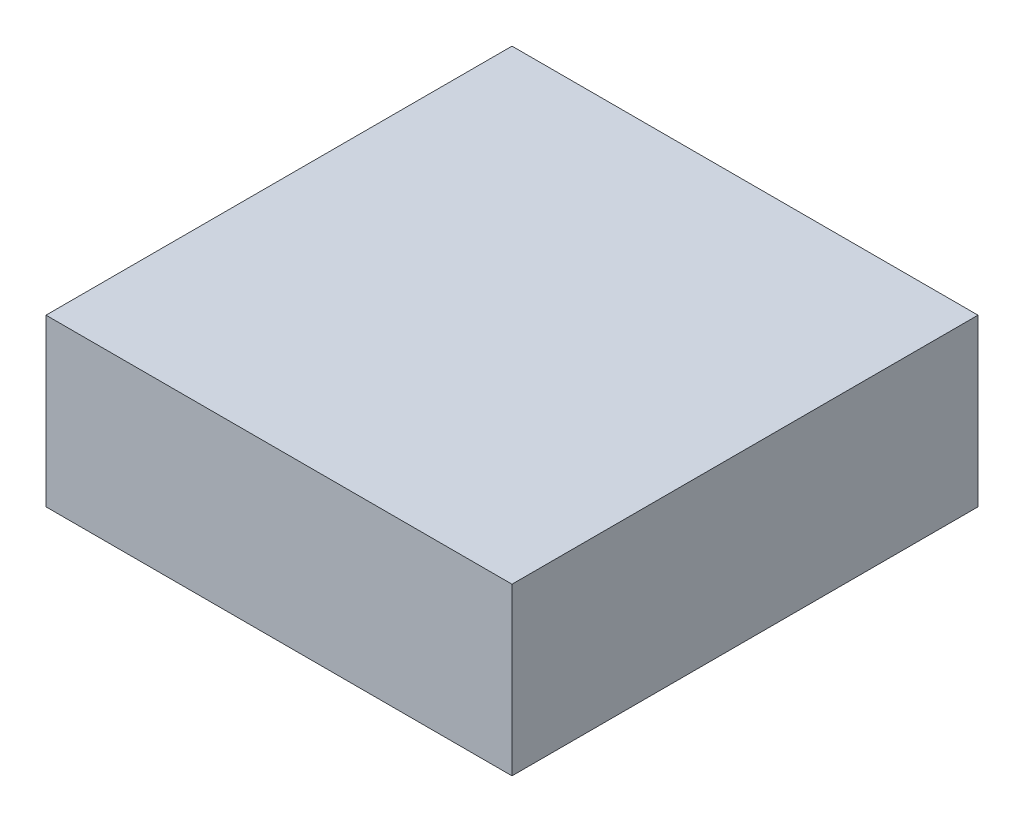
ISO-10303-21;
HEADER;
FILE_DESCRIPTION(('STEP AP214'),'2;1');
FILE_NAME('part.step','',(''),(''),'','','');
FILE_SCHEMA(('AUTOMOTIVE_DESIGN { 1 0 10303 214 1 1 1 1 }'));
ENDSEC;
DATA;
#1=APPLICATION_CONTEXT('core data for automotive mechanical design processes');
#2=APPLICATION_PROTOCOL_DEFINITION('international standard','automotive_design',2000,#1);
#3=PRODUCT_CONTEXT('',#1,'mechanical');
#4=PRODUCT('Part','Part','',(#3));
#5=PRODUCT_RELATED_PRODUCT_CATEGORY('part','',(#4));
#6=PRODUCT_DEFINITION_FORMATION('','',#4);
#7=PRODUCT_DEFINITION_CONTEXT('part definition',#1,'design');
#8=PRODUCT_DEFINITION('design','',#6,#7);
#9=PRODUCT_DEFINITION_SHAPE('','',#8);
#10=(LENGTH_UNIT() NAMED_UNIT(*) SI_UNIT(.MILLI.,.METRE.));
#11=(NAMED_UNIT(*) PLANE_ANGLE_UNIT() SI_UNIT($,.RADIAN.));
#12=(NAMED_UNIT(*) SI_UNIT($,.STERADIAN.) SOLID_ANGLE_UNIT());
#13=UNCERTAINTY_MEASURE_WITH_UNIT(LENGTH_MEASURE(1.E-05),#10,'distance_accuracy_value','');
#14=(GEOMETRIC_REPRESENTATION_CONTEXT(3) GLOBAL_UNCERTAINTY_ASSIGNED_CONTEXT((#13)) GLOBAL_UNIT_ASSIGNED_CONTEXT((#10,
#11,#12)) REPRESENTATION_CONTEXT('',''));
#15=CARTESIAN_POINT('',(0.,0.,0.));
#16=DIRECTION('',(0.,0.,1.));
#17=DIRECTION('',(1.,0.,0.));
#18=AXIS2_PLACEMENT_3D('',#15,#16,#17);
#19=CARTESIAN_POINT('',(-49.2103120119807,90.4875,-220.62999881807));
#20=DIRECTION('',(1.,0.,0.));
#21=DIRECTION('',(0.,0.,-1.));
#22=AXIS2_PLACEMENT_3D('',#19,#20,#21);
#23=PLANE('',#22);
#24=DIRECTION('',(0.,0.,1.));
#25=VECTOR('',#24,1.);
#26=CARTESIAN_POINT('',(-49.2103120119807,0.,-220.62999881807));
#27=LINE('',#26,#25);
#28=CARTESIAN_POINT('',(-49.2103120119807,0.,-220.62999881807));
#29=VERTEX_POINT('',#28);
#30=CARTESIAN_POINT('',(-49.2103120119807,0.,33.3700011819298));
#31=VERTEX_POINT('',#30);
#32=EDGE_CURVE('E108',#29,#31,#27,.T.);
#33=ORIENTED_EDGE('',*,*,#32,.T.);
#34=DIRECTION('',(0.,-1.,0.));
#35=VECTOR('',#34,1.);
#36=CARTESIAN_POINT('',(-49.2103120119807,90.4875,33.3700011819298));
#37=LINE('',#36,#35);
#38=CARTESIAN_POINT('',(-49.2103120119807,90.4875,33.3700011819298));
#39=VERTEX_POINT('',#38);
#40=EDGE_CURVE('E11',#39,#31,#37,.T.);
#41=ORIENTED_EDGE('',*,*,#40,.F.);
#42=DIRECTION('',(0.,0.,1.));
#43=VECTOR('',#42,1.);
#44=CARTESIAN_POINT('',(-49.2103120119807,90.4875,-220.62999881807));
#45=LINE('',#44,#43);
#46=CARTESIAN_POINT('',(-49.2103120119807,90.4875,-220.62999881807));
#47=VERTEX_POINT('',#46);
#48=EDGE_CURVE('E96',#47,#39,#45,.T.);
#49=ORIENTED_EDGE('',*,*,#48,.F.);
#50=DIRECTION('',(0.,-1.,0.));
#51=VECTOR('',#50,1.);
#52=CARTESIAN_POINT('',(-49.2103120119807,90.4875,-220.62999881807));
#53=LINE('',#52,#51);
#54=EDGE_CURVE('E104',#47,#29,#53,.T.);
#55=ORIENTED_EDGE('',*,*,#54,.T.);
#56=EDGE_LOOP('',(#33,#41,#49,#55));
#57=FACE_BOUND('',#56,.T.);
#58=ADVANCED_FACE('F45',(#57),#23,.F.);
#59=CARTESIAN_POINT('',(-49.2103120119807,90.4875,33.3700011819298));
#60=DIRECTION('',(0.,0.,-1.));
#61=DIRECTION('',(-1.,0.,0.));
#62=AXIS2_PLACEMENT_3D('',#59,#60,#61);
#63=PLANE('',#62);
#64=DIRECTION('',(1.,0.,0.));
#65=VECTOR('',#64,1.);
#66=CARTESIAN_POINT('',(-49.2103120119807,0.,33.3700011819298));
#67=LINE('',#66,#65);
#68=CARTESIAN_POINT('',(204.789687988019,0.,33.3700011819298));
#69=VERTEX_POINT('',#68);
#70=EDGE_CURVE('E100',#31,#69,#67,.T.);
#71=ORIENTED_EDGE('',*,*,#70,.T.);
#72=DIRECTION('',(0.,-1.,0.));
#73=VECTOR('',#72,1.);
#74=CARTESIAN_POINT('',(204.789687988019,90.4875,33.3700011819298));
#75=LINE('',#74,#73);
#76=CARTESIAN_POINT('',(204.789687988019,90.4875,33.3700011819298));
#77=VERTEX_POINT('',#76);
#78=EDGE_CURVE('E53',#77,#69,#75,.T.);
#79=ORIENTED_EDGE('',*,*,#78,.F.);
#80=DIRECTION('',(1.,0.,0.));
#81=VECTOR('',#80,1.);
#82=CARTESIAN_POINT('',(-49.2103120119807,90.4875,33.3700011819298));
#83=LINE('',#82,#81);
#84=EDGE_CURVE('E91',#39,#77,#83,.T.);
#85=ORIENTED_EDGE('',*,*,#84,.F.);
#86=ORIENTED_EDGE('',*,*,#40,.T.);
#87=EDGE_LOOP('',(#71,#79,#85,#86));
#88=FACE_BOUND('',#87,.T.);
#89=ADVANCED_FACE('F99',(#88),#63,.F.);
#90=CARTESIAN_POINT('',(204.789687988019,90.4875,-220.62999881807));
#91=DIRECTION('',(-1.,0.,0.));
#92=DIRECTION('',(0.,0.,1.));
#93=AXIS2_PLACEMENT_3D('',#90,#91,#92);
#94=PLANE('',#93);
#95=DIRECTION('',(0.,0.,-1.));
#96=VECTOR('',#95,1.);
#97=CARTESIAN_POINT('',(204.789687988019,0.,-220.62999881807));
#98=LINE('',#97,#96);
#99=CARTESIAN_POINT('',(204.789687988019,0.,-220.62999881807));
#100=VERTEX_POINT('',#99);
#101=EDGE_CURVE('E78',#69,#100,#98,.T.);
#102=ORIENTED_EDGE('',*,*,#101,.T.);
#103=DIRECTION('',(0.,-1.,0.));
#104=VECTOR('',#103,1.);
#105=CARTESIAN_POINT('',(204.789687988019,90.4875,-220.62999881807));
#106=LINE('',#105,#104);
#107=CARTESIAN_POINT('',(204.789687988019,90.4875,-220.62999881807));
#108=VERTEX_POINT('',#107);
#109=EDGE_CURVE('E101',#108,#100,#106,.T.);
#110=ORIENTED_EDGE('',*,*,#109,.F.);
#111=DIRECTION('',(0.,0.,-1.));
#112=VECTOR('',#111,1.);
#113=CARTESIAN_POINT('',(204.789687988019,90.4875,-220.62999881807));
#114=LINE('',#113,#112);
#115=EDGE_CURVE('E94',#77,#108,#114,.T.);
#116=ORIENTED_EDGE('',*,*,#115,.F.);
#117=ORIENTED_EDGE('',*,*,#78,.T.);
#118=EDGE_LOOP('',(#102,#110,#116,#117));
#119=FACE_BOUND('',#118,.T.);
#120=ADVANCED_FACE('F102',(#119),#94,.F.);
#121=CARTESIAN_POINT('',(-49.2103120119807,90.4875,-220.62999881807));
#122=DIRECTION('',(0.,0.,1.));
#123=DIRECTION('',(1.,0.,0.));
#124=AXIS2_PLACEMENT_3D('',#121,#122,#123);
#125=PLANE('',#124);
#126=DIRECTION('',(-1.,0.,0.));
#127=VECTOR('',#126,1.);
#128=CARTESIAN_POINT('',(-49.2103120119807,0.,-220.62999881807));
#129=LINE('',#128,#127);
#130=EDGE_CURVE('E84',#100,#29,#129,.T.);
#131=ORIENTED_EDGE('',*,*,#130,.T.);
#132=ORIENTED_EDGE('',*,*,#54,.F.);
#133=DIRECTION('',(-1.,0.,0.));
#134=VECTOR('',#133,1.);
#135=CARTESIAN_POINT('',(-49.2103120119807,90.4875,-220.62999881807));
#136=LINE('',#135,#134);
#137=EDGE_CURVE('E61',#108,#47,#136,.T.);
#138=ORIENTED_EDGE('',*,*,#137,.F.);
#139=ORIENTED_EDGE('',*,*,#109,.T.);
#140=EDGE_LOOP('',(#131,#132,#138,#139));
#141=FACE_BOUND('',#140,.T.);
#142=ADVANCED_FACE('F115',(#141),#125,.F.);
#143=CARTESIAN_POINT('',(0.,90.4875,0.));
#144=DIRECTION('',(0.,1.,0.));
#145=DIRECTION('',(0.,0.,1.));
#146=AXIS2_PLACEMENT_3D('',#143,#144,#145);
#147=PLANE('',#146);
#148=ORIENTED_EDGE('',*,*,#48,.T.);
#149=ORIENTED_EDGE('',*,*,#84,.T.);
#150=ORIENTED_EDGE('',*,*,#115,.T.);
#151=ORIENTED_EDGE('',*,*,#137,.T.);
#152=EDGE_LOOP('',(#148,#149,#150,#151));
#153=FACE_BOUND('',#152,.T.);
#154=ADVANCED_FACE('F92',(#153),#147,.T.);
#155=CARTESIAN_POINT('',(0.,0.,0.));
#156=DIRECTION('',(0.,1.,0.));
#157=DIRECTION('',(0.,0.,1.));
#158=AXIS2_PLACEMENT_3D('',#155,#156,#157);
#159=PLANE('',#158);
#160=ORIENTED_EDGE('',*,*,#32,.F.);
#161=ORIENTED_EDGE('',*,*,#130,.F.);
#162=ORIENTED_EDGE('',*,*,#101,.F.);
#163=ORIENTED_EDGE('',*,*,#70,.F.);
#164=EDGE_LOOP('',(#160,#161,#162,#163));
#165=FACE_BOUND('',#164,.T.);
#166=ADVANCED_FACE('F118',(#165),#159,.F.);
#167=CLOSED_SHELL('',(#58,#89,#120,#142,#154,#166));
#168=MANIFOLD_SOLID_BREP('B2',#167);
#169=ADVANCED_BREP_SHAPE_REPRESENTATION('',(#18,#168),#14);
#170=SHAPE_DEFINITION_REPRESENTATION(#9,#169);
ENDSEC;
END-ISO-10303-21;
